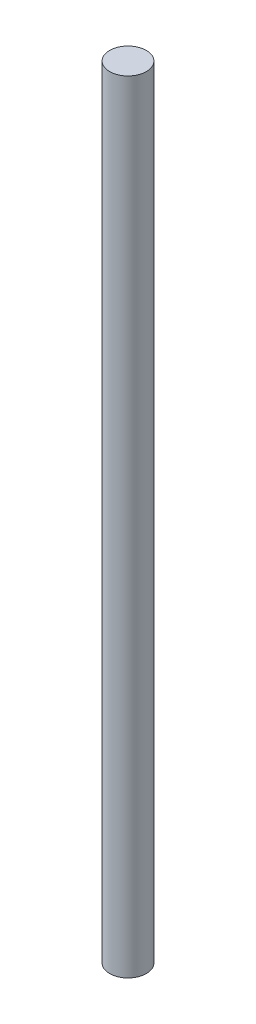
ISO-10303-21;
HEADER;
FILE_DESCRIPTION(('STEP AP214'),'2;1');
FILE_NAME('part.step','',(''),(''),'','','');
FILE_SCHEMA(('AUTOMOTIVE_DESIGN { 1 0 10303 214 1 1 1 1 }'));
ENDSEC;
DATA;
#1=APPLICATION_CONTEXT('core data for automotive mechanical design processes');
#2=APPLICATION_PROTOCOL_DEFINITION('international standard','automotive_design',2000,#1);
#3=PRODUCT_CONTEXT('',#1,'mechanical');
#4=PRODUCT('Part','Part','',(#3));
#5=PRODUCT_RELATED_PRODUCT_CATEGORY('part','',(#4));
#6=PRODUCT_DEFINITION_FORMATION('','',#4);
#7=PRODUCT_DEFINITION_CONTEXT('part definition',#1,'design');
#8=PRODUCT_DEFINITION('design','',#6,#7);
#9=PRODUCT_DEFINITION_SHAPE('','',#8);
#10=(LENGTH_UNIT() NAMED_UNIT(*) SI_UNIT(.MILLI.,.METRE.));
#11=(NAMED_UNIT(*) PLANE_ANGLE_UNIT() SI_UNIT($,.RADIAN.));
#12=(NAMED_UNIT(*) SI_UNIT($,.STERADIAN.) SOLID_ANGLE_UNIT());
#13=UNCERTAINTY_MEASURE_WITH_UNIT(LENGTH_MEASURE(1.E-05),#10,'distance_accuracy_value','');
#14=(GEOMETRIC_REPRESENTATION_CONTEXT(3) GLOBAL_UNCERTAINTY_ASSIGNED_CONTEXT((#13)) GLOBAL_UNIT_ASSIGNED_CONTEXT((#10,
#11,#12)) REPRESENTATION_CONTEXT('',''));
#15=CARTESIAN_POINT('',(0.,0.,0.));
#16=DIRECTION('',(0.,0.,1.));
#17=DIRECTION('',(1.,0.,0.));
#18=AXIS2_PLACEMENT_3D('',#15,#16,#17);
#19=CARTESIAN_POINT('',(0.,264.,0.));
#20=DIRECTION('',(0.,-1.,0.));
#21=DIRECTION('',(0.,0.,-1.));
#22=AXIS2_PLACEMENT_3D('',#19,#20,#21);
#23=CYLINDRICAL_SURFACE('',#22,6.2);
#24=CARTESIAN_POINT('',(0.,264.,0.));
#25=DIRECTION('',(0.,1.,0.));
#26=DIRECTION('',(0.,0.,1.));
#27=AXIS2_PLACEMENT_3D('',#24,#25,#26);
#28=CIRCLE('',#27,6.2);
#29=CARTESIAN_POINT('',(0.,264.,6.2));
#30=VERTEX_POINT('',#29);
#31=EDGE_CURVE('E10',#30,#30,#28,.T.);
#32=ORIENTED_EDGE('',*,*,#31,.F.);
#33=EDGE_LOOP('',(#32));
#34=FACE_BOUND('',#33,.T.);
#35=CARTESIAN_POINT('',(0.,0.,0.));
#36=DIRECTION('',(0.,1.,0.));
#37=DIRECTION('',(0.,0.,1.));
#38=AXIS2_PLACEMENT_3D('',#35,#36,#37);
#39=CIRCLE('',#38,6.2);
#40=CARTESIAN_POINT('',(0.,0.,6.2));
#41=VERTEX_POINT('',#40);
#42=EDGE_CURVE('E35',#41,#41,#39,.T.);
#43=ORIENTED_EDGE('',*,*,#42,.T.);
#44=EDGE_LOOP('',(#43));
#45=FACE_BOUND('',#44,.T.);
#46=ADVANCED_FACE('F32',(#34,#45),#23,.T.);
#47=CARTESIAN_POINT('',(0.,264.,0.));
#48=DIRECTION('',(0.,1.,0.));
#49=DIRECTION('',(0.,0.,1.));
#50=AXIS2_PLACEMENT_3D('',#47,#48,#49);
#51=PLANE('',#50);
#52=ORIENTED_EDGE('',*,*,#31,.T.);
#53=EDGE_LOOP('',(#52));
#54=FACE_BOUND('',#53,.T.);
#55=ADVANCED_FACE('F47',(#54),#51,.T.);
#56=CARTESIAN_POINT('',(0.,0.,0.));
#57=DIRECTION('',(0.,1.,0.));
#58=DIRECTION('',(0.,0.,1.));
#59=AXIS2_PLACEMENT_3D('',#56,#57,#58);
#60=PLANE('',#59);
#61=ORIENTED_EDGE('',*,*,#42,.F.);
#62=EDGE_LOOP('',(#61));
#63=FACE_BOUND('',#62,.T.);
#64=ADVANCED_FACE('F45',(#63),#60,.F.);
#65=CLOSED_SHELL('',(#46,#55,#64));
#66=MANIFOLD_SOLID_BREP('B2',#65);
#67=ADVANCED_BREP_SHAPE_REPRESENTATION('',(#18,#66),#14);
#68=SHAPE_DEFINITION_REPRESENTATION(#9,#67);
ENDSEC;
END-ISO-10303-21;
